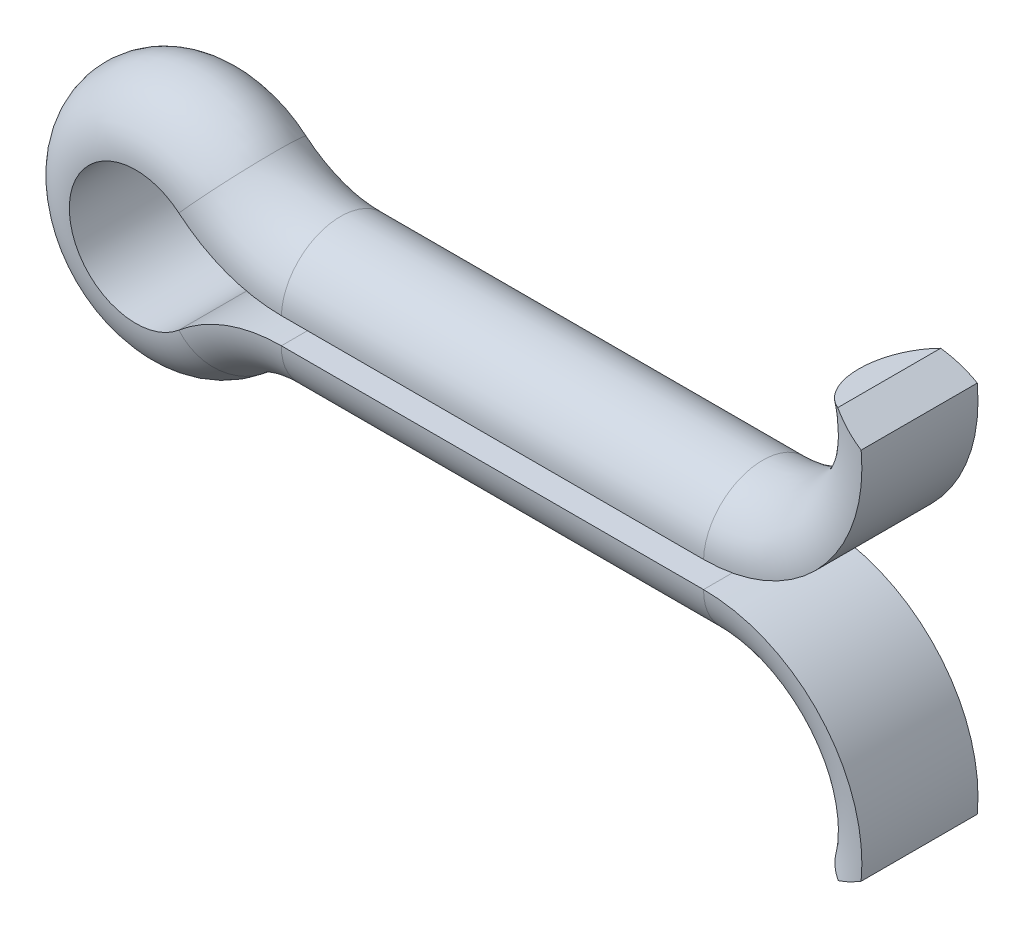
ISO-10303-21;
HEADER;
FILE_DESCRIPTION(('STEP AP214'),'2;1');
FILE_NAME('part.step','',(''),(''),'','','');
FILE_SCHEMA(('AUTOMOTIVE_DESIGN { 1 0 10303 214 1 1 1 1 }'));
ENDSEC;
DATA;
#1=APPLICATION_CONTEXT('core data for automotive mechanical design processes');
#2=APPLICATION_PROTOCOL_DEFINITION('international standard','automotive_design',2000,#1);
#3=PRODUCT_CONTEXT('',#1,'mechanical');
#4=PRODUCT('Part','Part','',(#3));
#5=PRODUCT_RELATED_PRODUCT_CATEGORY('part','',(#4));
#6=PRODUCT_DEFINITION_FORMATION('','',#4);
#7=PRODUCT_DEFINITION_CONTEXT('part definition',#1,'design');
#8=PRODUCT_DEFINITION('design','',#6,#7);
#9=PRODUCT_DEFINITION_SHAPE('','',#8);
#10=(LENGTH_UNIT() NAMED_UNIT(*) SI_UNIT(.MILLI.,.METRE.));
#11=(NAMED_UNIT(*) PLANE_ANGLE_UNIT() SI_UNIT($,.RADIAN.));
#12=(NAMED_UNIT(*) SI_UNIT($,.STERADIAN.) SOLID_ANGLE_UNIT());
#13=UNCERTAINTY_MEASURE_WITH_UNIT(LENGTH_MEASURE(1.E-05),#10,'distance_accuracy_value','');
#14=(GEOMETRIC_REPRESENTATION_CONTEXT(3) GLOBAL_UNCERTAINTY_ASSIGNED_CONTEXT((#13)) GLOBAL_UNIT_ASSIGNED_CONTEXT((#10,
#11,#12)) REPRESENTATION_CONTEXT('',''));
#15=CARTESIAN_POINT('',(0.,0.,0.));
#16=DIRECTION('',(0.,0.,1.));
#17=DIRECTION('',(1.,0.,0.));
#18=AXIS2_PLACEMENT_3D('',#15,#16,#17);
#19=CARTESIAN_POINT('',(10.7572239444696,0.23714244741711,0.));
#20=DIRECTION('',(-0.999803952627873,0.0198004118564028,0.));
#21=DIRECTION('',(0.0198004118564028,0.999803952627873,0.));
#22=AXIS2_PLACEMENT_3D('',#19,#20,#21);
#23=CIRCLE('',#22,1.10004587155963);
#24=CARTESIAN_POINT('',(10.757422856864,3.24718634951002,0.));
#25=DIRECTION('',(0.,0.,1.));
#26=AXIS1_PLACEMENT('',#24,#25);
#27=SURFACE_OF_REVOLUTION('',#23,#26);
#28=CARTESIAN_POINT('',(10.757422856864,3.24718634951002,1.1));
#29=DIRECTION('',(0.,0.,1.));
#30=DIRECTION('',(1.,0.,0.));
#31=AXIS2_PLACEMENT_3D('',#28,#29,#30);
#32=CIRCLE('',#31,3.);
#33=CARTESIAN_POINT('',(10.757422856864,0.24718634951002,1.1));
#34=VERTEX_POINT('',#33);
#35=CARTESIAN_POINT('',(13.743651560264,3.53430676151482,1.1));
#36=VERTEX_POINT('',#35);
#37=EDGE_CURVE('E242',#34,#36,#32,.T.);
#38=ORIENTED_EDGE('',*,*,#37,.T.);
#39=CARTESIAN_POINT('',(13.743651560264,3.53430676151482,1.1));
#40=CARTESIAN_POINT('',(13.6639591945721,3.5833367769402,1.09931651114886));
#41=CARTESIAN_POINT('',(13.5844866817006,3.63223152988366,1.09106448730482));
#42=CARTESIAN_POINT('',(13.4281622196186,3.72840875740991,1.06155884328309));
#43=CARTESIAN_POINT('',(13.351291204114,3.77570296235956,1.040447098492));
#44=CARTESIAN_POINT('',(13.2589826967481,3.83249494614313,1.00787138563784));
#45=CARTESIAN_POINT('',(13.2421129173444,3.84287392708073,1.00161384641751));
#46=CARTESIAN_POINT('',(13.2084837132334,3.86356399421563,0.988544468433443));
#47=CARTESIAN_POINT('',(13.1917246622376,3.87387485049036,0.98173130355574));
#48=CARTESIAN_POINT('',(13.1750413859679,3.88413908704235,0.974655902583276));
#49=B_SPLINE_CURVE_WITH_KNOTS('',3,(#39,#40,#41,#42,#43,#44,#45,#46,#47,#48),.UNSPECIFIED.,.F.,
.F.,(4,2,2,2,4),(0.,0.280156940301102,0.557277650545242,0.619591216138997,0.682058121337036),.UNSPECIFIED.);
#50=CARTESIAN_POINT('',(13.1750413859678,3.88413908704235,0.974655902583249));
#51=VERTEX_POINT('',#50);
#52=EDGE_CURVE('E41',#36,#51,#49,.T.);
#53=ORIENTED_EDGE('',*,*,#52,.T.);
#54=CARTESIAN_POINT('',(13.6712048751013,4.00232784770073,0.));
#55=DIRECTION('',(0.231721825915332,-0.972782090395616,0.));
#56=DIRECTION('',(-0.972782090395616,-0.231721825915332,0.));
#57=AXIS2_PLACEMENT_3D('',#54,#55,#56);
#58=CIRCLE('',#57,1.10004587155963);
#59=CARTESIAN_POINT('',(13.1750413859678,3.88413908704235,-0.974655902583249));
#60=VERTEX_POINT('',#59);
#61=EDGE_CURVE('E240',#51,#60,#58,.T.);
#62=ORIENTED_EDGE('',*,*,#61,.T.);
#63=CARTESIAN_POINT('',(13.1750413859678,3.88413908704235,-0.97465590258325));
#64=CARTESIAN_POINT('',(13.197955964446,3.87004109752357,-0.984374503566978));
#65=CARTESIAN_POINT('',(13.2210233362983,3.85584910324753,-0.99360122509593));
#66=CARTESIAN_POINT('',(13.2673228504737,3.82736374113664,-1.01097652300712));
#67=CARTESIAN_POINT('',(13.2905535829449,3.81307124070054,-1.01913028263372));
#68=CARTESIAN_POINT('',(13.3371859827838,3.78438107366164,-1.03433659609465));
#69=CARTESIAN_POINT('',(13.3605867388318,3.76998396774014,-1.04139299280795));
#70=CARTESIAN_POINT('',(13.4075661035033,3.74108033369036,-1.05437434578761));
#71=CARTESIAN_POINT('',(13.4311442653871,3.7265740804147,-1.06030152626175));
#72=CARTESIAN_POINT('',(13.4785045819684,3.69743606910869,-1.07099110469864));
#73=CARTESIAN_POINT('',(13.502286835833,3.68280425006665,-1.0757528988519));
#74=CARTESIAN_POINT('',(13.5500439906018,3.65342208761412,-1.08405951934727));
#75=CARTESIAN_POINT('',(13.5740191367379,3.63867159332682,-1.08760240868797));
#76=CARTESIAN_POINT('',(13.6221674679681,3.60904876305406,-1.09341533186464));
#77=CARTESIAN_POINT('',(13.6463410532516,3.59417618085564,-1.09568083449255));
#78=CARTESIAN_POINT('',(13.6948910881055,3.56430620602023,-1.09887283326476));
#79=CARTESIAN_POINT('',(13.7192679057749,3.54930858691365,-1.09979157105641));
#80=CARTESIAN_POINT('',(13.743651560264,3.53430676151483,-1.1));
#81=B_SPLINE_CURVE_WITH_KNOTS('',3,(#63,#64,#65,#66,#67,#68,#69,#70,#71,#72,#73,#74,#75,#76,#77,
#78,#79,#80),.UNSPECIFIED.,.F.,.F.,(4,2,2,2,2,2,2,2,4),(0.,0.0858144885708894,0.171197886000917,
0.256275196220509,0.34118315745957,0.426135018482316,0.5112212623776,0.596607459526603,
0.682483636615101),.UNSPECIFIED.);
#82=CARTESIAN_POINT('',(13.743651560264,3.53430676151482,-1.1));
#83=VERTEX_POINT('',#82);
#84=EDGE_CURVE('E263',#60,#83,#81,.T.);
#85=ORIENTED_EDGE('',*,*,#84,.T.);
#86=CARTESIAN_POINT('',(10.757422856864,3.24718634951002,-1.1));
#87=DIRECTION('',(0.,0.,1.));
#88=DIRECTION('',(1.,0.,0.));
#89=AXIS2_PLACEMENT_3D('',#86,#87,#88);
#90=CIRCLE('',#89,3.);
#91=CARTESIAN_POINT('',(10.757422856864,0.24718634951002,-1.1));
#92=VERTEX_POINT('',#91);
#93=EDGE_CURVE('E244',#92,#83,#90,.T.);
#94=ORIENTED_EDGE('',*,*,#93,.F.);
#95=EDGE_CURVE('E228',#34,#92,#23,.T.);
#96=ORIENTED_EDGE('',*,*,#95,.F.);
#97=EDGE_LOOP('',(#38,#53,#62,#85,#94,#96));
#98=FACE_BOUND('',#97,.T.);
#99=ADVANCED_FACE('F32',(#98),#27,.T.);
#100=CARTESIAN_POINT('',(10.757422856864,3.24718634951002,0.));
#101=DIRECTION('',(0.,0.,1.));
#102=DIRECTION('',(1.,0.,0.));
#103=AXIS2_PLACEMENT_3D('',#100,#101,#102);
#104=CYLINDRICAL_SURFACE('',#103,3.);
#105=ORIENTED_EDGE('',*,*,#93,.T.);
#106=DIRECTION('',(0.,0.,1.));
#107=VECTOR('',#106,1.);
#108=CARTESIAN_POINT('',(13.743651560264,3.53430676151482,0.));
#109=LINE('',#108,#107);
#110=EDGE_CURVE('E261',#83,#36,#109,.T.);
#111=ORIENTED_EDGE('',*,*,#110,.T.);
#112=ORIENTED_EDGE('',*,*,#37,.F.);
#113=DIRECTION('',(0.,0.,1.));
#114=VECTOR('',#113,1.);
#115=CARTESIAN_POINT('',(10.757422856864,0.24718634951002,1.1));
#116=LINE('',#115,#114);
#117=EDGE_CURVE('E234',#92,#34,#116,.T.);
#118=ORIENTED_EDGE('',*,*,#117,.F.);
#119=EDGE_LOOP('',(#105,#111,#112,#118));
#120=FACE_BOUND('',#119,.T.);
#121=ADVANCED_FACE('F216',(#120),#104,.T.);
#122=CARTESIAN_POINT('',(2.75722394446964,0.237142447417109,0.));
#123=DIRECTION('',(-0.999803952627873,0.0198004118564028,0.));
#124=DIRECTION('',(0.0198004118564028,0.999803952627873,0.));
#125=AXIS2_PLACEMENT_3D('',#122,#123,#124);
#126=CIRCLE('',#125,1.10004587155963);
#127=DIRECTION('',(1.,0.,0.));
#128=VECTOR('',#127,1.);
#129=SURFACE_OF_LINEAR_EXTRUSION('',#126,#128);
#130=CARTESIAN_POINT('',(2.75742285686398,0.247186349510019,1.1));
#131=VERTEX_POINT('',#130);
#132=CARTESIAN_POINT('',(2.75742285686398,0.247186349510019,-1.1));
#133=VERTEX_POINT('',#132);
#134=EDGE_CURVE('E207',#131,#133,#126,.T.);
#135=ORIENTED_EDGE('',*,*,#134,.F.);
#136=DIRECTION('',(1.,0.,0.));
#137=VECTOR('',#136,1.);
#138=CARTESIAN_POINT('',(2.75742285686398,0.247186349510019,1.1));
#139=LINE('',#138,#137);
#140=EDGE_CURVE('E233',#131,#34,#139,.T.);
#141=ORIENTED_EDGE('',*,*,#140,.T.);
#142=ORIENTED_EDGE('',*,*,#95,.T.);
#143=DIRECTION('',(1.,0.,0.));
#144=VECTOR('',#143,1.);
#145=CARTESIAN_POINT('',(2.75742285686398,0.247186349510019,-1.1));
#146=LINE('',#145,#144);
#147=EDGE_CURVE('E237',#133,#92,#146,.T.);
#148=ORIENTED_EDGE('',*,*,#147,.F.);
#149=EDGE_LOOP('',(#135,#141,#142,#148));
#150=FACE_BOUND('',#149,.T.);
#151=ADVANCED_FACE('F213',(#150),#129,.F.);
#152=CARTESIAN_POINT('',(2.75742285686398,0.247186349510019,1.1));
#153=DIRECTION('',(0.,1.,0.));
#154=DIRECTION('',(-1.,0.,0.));
#155=AXIS2_PLACEMENT_3D('',#152,#153,#154);
#156=PLANE('',#155);
#157=DIRECTION('',(0.,0.,1.));
#158=VECTOR('',#157,1.);
#159=CARTESIAN_POINT('',(2.75742285686398,0.247186349510019,1.1));
#160=LINE('',#159,#158);
#161=EDGE_CURVE('E204',#133,#131,#160,.T.);
#162=ORIENTED_EDGE('',*,*,#161,.F.);
#163=ORIENTED_EDGE('',*,*,#147,.T.);
#164=ORIENTED_EDGE('',*,*,#117,.T.);
#165=ORIENTED_EDGE('',*,*,#140,.F.);
#166=EDGE_LOOP('',(#162,#163,#164,#165));
#167=FACE_BOUND('',#166,.T.);
#168=ADVANCED_FACE('F189',(#167),#156,.F.);
#169=CARTESIAN_POINT('',(0.808922912871809,0.95290818408294,0.));
#170=DIRECTION('',(-0.749284422284325,0.662248332970379,0.));
#171=DIRECTION('',(0.662248332970379,0.749284422284325,0.));
#172=AXIS2_PLACEMENT_3D('',#169,#170,#171);
#173=CIRCLE('',#172,1.10004587155963);
#174=CARTESIAN_POINT('',(2.75742285686396,3.24718634951002,0.));
#175=DIRECTION('',(0.,0.,1.));
#176=AXIS1_PLACEMENT('',#174,#175);
#177=SURFACE_OF_REVOLUTION('',#173,#176);
#178=CARTESIAN_POINT('',(0.815575774565408,0.96043539915084,1.1));
#179=VERTEX_POINT('',#178);
#180=CARTESIAN_POINT('',(0.815575774565408,0.96043539915084,-1.1));
#181=VERTEX_POINT('',#180);
#182=EDGE_CURVE('E192',#179,#181,#173,.T.);
#183=ORIENTED_EDGE('',*,*,#182,.F.);
#184=CARTESIAN_POINT('',(2.75742285686396,3.24718634951002,1.1));
#185=DIRECTION('',(0.,0.,1.));
#186=DIRECTION('',(1.,0.,0.));
#187=AXIS2_PLACEMENT_3D('',#184,#185,#186);
#188=CIRCLE('',#187,3.);
#189=EDGE_CURVE('E211',#179,#131,#188,.T.);
#190=ORIENTED_EDGE('',*,*,#189,.T.);
#191=ORIENTED_EDGE('',*,*,#134,.T.);
#192=CARTESIAN_POINT('',(2.75742285686396,3.24718634951002,-1.1));
#193=DIRECTION('',(0.,0.,1.));
#194=DIRECTION('',(1.,0.,0.));
#195=AXIS2_PLACEMENT_3D('',#192,#193,#194);
#196=CIRCLE('',#195,3.);
#197=EDGE_CURVE('E429',#181,#133,#196,.T.);
#198=ORIENTED_EDGE('',*,*,#197,.F.);
#199=EDGE_LOOP('',(#183,#190,#191,#198));
#200=FACE_BOUND('',#199,.T.);
#201=ADVANCED_FACE('F184',(#200),#177,.T.);
#202=CARTESIAN_POINT('',(2.75742285686396,3.24718634951002,0.));
#203=DIRECTION('',(0.,0.,1.));
#204=DIRECTION('',(1.,0.,0.));
#205=AXIS2_PLACEMENT_3D('',#202,#203,#204);
#206=CYLINDRICAL_SURFACE('',#205,3.);
#207=DIRECTION('',(0.,0.,1.));
#208=VECTOR('',#207,1.);
#209=CARTESIAN_POINT('',(0.815575774565408,0.96043539915084,1.1));
#210=LINE('',#209,#208);
#211=EDGE_CURVE('E198',#181,#179,#210,.T.);
#212=ORIENTED_EDGE('',*,*,#211,.F.);
#213=ORIENTED_EDGE('',*,*,#197,.T.);
#214=ORIENTED_EDGE('',*,*,#161,.T.);
#215=ORIENTED_EDGE('',*,*,#189,.F.);
#216=EDGE_LOOP('',(#212,#213,#214,#215));
#217=FACE_BOUND('',#216,.T.);
#218=ADVANCED_FACE('F180',(#217),#206,.T.);
#219=CARTESIAN_POINT('',(0.809226154942991,-0.952650679114565,0.));
#220=DIRECTION('',(0.774917336945426,0.632062592550302,0.));
#221=DIRECTION('',(0.632062592550302,-0.774917336945426,0.));
#222=AXIS2_PLACEMENT_3D('',#219,#220,#221);
#223=CIRCLE('',#222,1.10004587155963);
#224=CARTESIAN_POINT('',(0.,0.,0.));
#225=DIRECTION('',(0.,0.,-1.));
#226=AXIS1_PLACEMENT('',#224,#225);
#227=SURFACE_OF_REVOLUTION('',#223,#226);
#228=CARTESIAN_POINT('',(0.815575774565398,-0.960435399150849,1.1));
#229=VERTEX_POINT('',#228);
#230=CARTESIAN_POINT('',(0.815575774565398,-0.960435399150849,-1.1));
#231=VERTEX_POINT('',#230);
#232=EDGE_CURVE('E171',#229,#231,#223,.T.);
#233=ORIENTED_EDGE('',*,*,#232,.F.);
#234=CARTESIAN_POINT('',(0.,0.,1.1));
#235=DIRECTION('',(0.,0.,-1.));
#236=DIRECTION('',(-1.,0.,0.));
#237=AXIS2_PLACEMENT_3D('',#234,#235,#236);
#238=CIRCLE('',#237,1.26);
#239=EDGE_CURVE('E197',#229,#179,#238,.T.);
#240=ORIENTED_EDGE('',*,*,#239,.T.);
#241=ORIENTED_EDGE('',*,*,#182,.T.);
#242=CARTESIAN_POINT('',(0.,0.,-1.1));
#243=DIRECTION('',(0.,0.,-1.));
#244=DIRECTION('',(-1.,0.,0.));
#245=AXIS2_PLACEMENT_3D('',#242,#243,#244);
#246=CIRCLE('',#245,1.26);
#247=EDGE_CURVE('E201',#231,#181,#246,.T.);
#248=ORIENTED_EDGE('',*,*,#247,.F.);
#249=EDGE_LOOP('',(#233,#240,#241,#248));
#250=FACE_BOUND('',#249,.T.);
#251=ADVANCED_FACE('F177',(#250),#227,.T.);
#252=CARTESIAN_POINT('',(0.,0.,0.));
#253=DIRECTION('',(0.,0.,-1.));
#254=DIRECTION('',(-1.,0.,0.));
#255=AXIS2_PLACEMENT_3D('',#252,#253,#254);
#256=CYLINDRICAL_SURFACE('',#255,1.26);
#257=DIRECTION('',(0.,0.,1.));
#258=VECTOR('',#257,1.);
#259=CARTESIAN_POINT('',(0.815575774565398,-0.960435399150849,1.1));
#260=LINE('',#259,#258);
#261=EDGE_CURVE('E168',#231,#229,#260,.T.);
#262=ORIENTED_EDGE('',*,*,#261,.F.);
#263=ORIENTED_EDGE('',*,*,#247,.T.);
#264=ORIENTED_EDGE('',*,*,#211,.T.);
#265=ORIENTED_EDGE('',*,*,#239,.F.);
#266=EDGE_LOOP('',(#262,#263,#264,#265));
#267=FACE_BOUND('',#266,.T.);
#268=ADVANCED_FACE('F161',(#267),#256,.F.);
#269=CARTESIAN_POINT('',(2.7576217692583,-0.237142447417109,0.));
#270=DIRECTION('',(0.999803952627873,-0.0198004118563884,0.));
#271=DIRECTION('',(-0.0198004118563884,-0.999803952627873,0.));
#272=AXIS2_PLACEMENT_3D('',#269,#270,#271);
#273=CIRCLE('',#272,1.10004587155963);
#274=CARTESIAN_POINT('',(2.75742285686396,-3.24718634951002,0.));
#275=DIRECTION('',(0.,0.,1.));
#276=AXIS1_PLACEMENT('',#274,#275);
#277=SURFACE_OF_REVOLUTION('',#273,#276);
#278=CARTESIAN_POINT('',(2.75742285686396,-0.247186349510019,1.1));
#279=VERTEX_POINT('',#278);
#280=CARTESIAN_POINT('',(2.75742285686396,-0.247186349510019,-1.1));
#281=VERTEX_POINT('',#280);
#282=EDGE_CURVE('E118',#279,#281,#273,.T.);
#283=ORIENTED_EDGE('',*,*,#282,.F.);
#284=CARTESIAN_POINT('',(2.75742285686396,-3.24718634951002,1.1));
#285=DIRECTION('',(0.,0.,1.));
#286=DIRECTION('',(1.,0.,0.));
#287=AXIS2_PLACEMENT_3D('',#284,#285,#286);
#288=CIRCLE('',#287,3.);
#289=EDGE_CURVE('E175',#279,#229,#288,.T.);
#290=ORIENTED_EDGE('',*,*,#289,.T.);
#291=ORIENTED_EDGE('',*,*,#232,.T.);
#292=CARTESIAN_POINT('',(2.75742285686396,-3.24718634951002,-1.1));
#293=DIRECTION('',(0.,0.,1.));
#294=DIRECTION('',(1.,0.,0.));
#295=AXIS2_PLACEMENT_3D('',#292,#293,#294);
#296=CIRCLE('',#295,3.);
#297=EDGE_CURVE('E431',#281,#231,#296,.T.);
#298=ORIENTED_EDGE('',*,*,#297,.F.);
#299=EDGE_LOOP('',(#283,#290,#291,#298));
#300=FACE_BOUND('',#299,.T.);
#301=ADVANCED_FACE('F156',(#300),#277,.T.);
#302=CARTESIAN_POINT('',(2.75742285686396,-3.24718634951002,0.));
#303=DIRECTION('',(0.,0.,1.));
#304=DIRECTION('',(1.,0.,0.));
#305=AXIS2_PLACEMENT_3D('',#302,#303,#304);
#306=CYLINDRICAL_SURFACE('',#305,3.);
#307=DIRECTION('',(0.,0.,1.));
#308=VECTOR('',#307,1.);
#309=CARTESIAN_POINT('',(2.75742285686396,-0.247186349510019,1.1));
#310=LINE('',#309,#308);
#311=EDGE_CURVE('E114',#281,#279,#310,.T.);
#312=ORIENTED_EDGE('',*,*,#311,.F.);
#313=ORIENTED_EDGE('',*,*,#297,.T.);
#314=ORIENTED_EDGE('',*,*,#261,.T.);
#315=ORIENTED_EDGE('',*,*,#289,.F.);
#316=EDGE_LOOP('',(#312,#313,#314,#315));
#317=FACE_BOUND('',#316,.T.);
#318=ADVANCED_FACE('F153',(#317),#306,.T.);
#319=CARTESIAN_POINT('',(10.7576217692583,-0.237142447417108,0.));
#320=DIRECTION('',(0.999803952627873,-0.0198004118563884,0.));
#321=DIRECTION('',(-0.0198004118563884,-0.999803952627873,0.));
#322=AXIS2_PLACEMENT_3D('',#319,#320,#321);
#323=CIRCLE('',#322,1.10004587155963);
#324=DIRECTION('',(-1.,0.,0.));
#325=VECTOR('',#324,1.);
#326=SURFACE_OF_LINEAR_EXTRUSION('',#323,#325);
#327=CARTESIAN_POINT('',(10.757422856864,-0.247186349510018,1.1));
#328=VERTEX_POINT('',#327);
#329=CARTESIAN_POINT('',(10.757422856864,-0.247186349510018,-1.1));
#330=VERTEX_POINT('',#329);
#331=EDGE_CURVE('E121',#328,#330,#323,.T.);
#332=ORIENTED_EDGE('',*,*,#331,.F.);
#333=DIRECTION('',(-1.,0.,0.));
#334=VECTOR('',#333,1.);
#335=CARTESIAN_POINT('',(10.757422856864,-0.247186349510018,1.1));
#336=LINE('',#335,#334);
#337=EDGE_CURVE('E107',#328,#279,#336,.T.);
#338=ORIENTED_EDGE('',*,*,#337,.T.);
#339=ORIENTED_EDGE('',*,*,#282,.T.);
#340=DIRECTION('',(-1.,0.,0.));
#341=VECTOR('',#340,1.);
#342=CARTESIAN_POINT('',(10.757422856864,-0.247186349510018,-1.1));
#343=LINE('',#342,#341);
#344=EDGE_CURVE('E117',#330,#281,#343,.T.);
#345=ORIENTED_EDGE('',*,*,#344,.F.);
#346=EDGE_LOOP('',(#332,#338,#339,#345));
#347=FACE_BOUND('',#346,.T.);
#348=ADVANCED_FACE('F123',(#347),#326,.F.);
#349=CARTESIAN_POINT('',(10.757422856864,-0.247186349510018,1.1));
#350=DIRECTION('',(0.,-1.,0.));
#351=DIRECTION('',(1.,0.,0.));
#352=AXIS2_PLACEMENT_3D('',#349,#350,#351);
#353=PLANE('',#352);
#354=DIRECTION('',(0.,0.,1.));
#355=VECTOR('',#354,1.);
#356=CARTESIAN_POINT('',(10.757422856864,-0.247186349510018,1.1));
#357=LINE('',#356,#355);
#358=EDGE_CURVE('E112',#330,#328,#357,.T.);
#359=ORIENTED_EDGE('',*,*,#358,.F.);
#360=ORIENTED_EDGE('',*,*,#344,.T.);
#361=ORIENTED_EDGE('',*,*,#311,.T.);
#362=ORIENTED_EDGE('',*,*,#337,.F.);
#363=EDGE_LOOP('',(#359,#360,#361,#362));
#364=FACE_BOUND('',#363,.T.);
#365=ADVANCED_FACE('F109',(#364),#353,.F.);
#366=CARTESIAN_POINT('',(10.757422856864,-3.24718634951002,0.));
#367=DIRECTION('',(0.,0.,-1.));
#368=DIRECTION('',(-1.,0.,0.));
#369=AXIS2_PLACEMENT_3D('',#366,#367,#368);
#370=CYLINDRICAL_SURFACE('',#369,3.);
#371=CARTESIAN_POINT('',(10.757422856864,-3.24718634951002,1.1));
#372=DIRECTION('',(0.,0.,-1.));
#373=DIRECTION('',(-1.,0.,0.));
#374=AXIS2_PLACEMENT_3D('',#371,#372,#373);
#375=CIRCLE('',#374,3.);
#376=CARTESIAN_POINT('',(13.7429142387769,-3.54187467388624,1.1));
#377=VERTEX_POINT('',#376);
#378=EDGE_CURVE('E127',#328,#377,#375,.T.);
#379=ORIENTED_EDGE('',*,*,#378,.T.);
#380=DIRECTION('',(0.,0.,-1.));
#381=VECTOR('',#380,1.);
#382=CARTESIAN_POINT('',(13.7429142387769,-3.54187467388624,0.));
#383=LINE('',#382,#381);
#384=CARTESIAN_POINT('',(13.7429142387769,-3.54187467388624,-1.1));
#385=VERTEX_POINT('',#384);
#386=EDGE_CURVE('E259',#377,#385,#383,.T.);
#387=ORIENTED_EDGE('',*,*,#386,.T.);
#388=CARTESIAN_POINT('',(10.757422856864,-3.24718634951002,-1.1));
#389=DIRECTION('',(0.,0.,-1.));
#390=DIRECTION('',(-1.,0.,0.));
#391=AXIS2_PLACEMENT_3D('',#388,#389,#390);
#392=CIRCLE('',#391,3.);
#393=EDGE_CURVE('E135',#330,#385,#392,.T.);
#394=ORIENTED_EDGE('',*,*,#393,.F.);
#395=ORIENTED_EDGE('',*,*,#358,.T.);
#396=EDGE_LOOP('',(#379,#387,#394,#395));
#397=FACE_BOUND('',#396,.T.);
#398=ADVANCED_FACE('F137',(#397),#370,.T.);
#399=CARTESIAN_POINT('',(10.757422856864,-3.24718634951002,0.));
#400=DIRECTION('',(0.,0.,-1.));
#401=AXIS1_PLACEMENT('',#399,#400);
#402=SURFACE_OF_REVOLUTION('',#323,#401);
#403=CARTESIAN_POINT('',(13.6711050457908,-4.00271294336578,0.));
#404=DIRECTION('',(-0.270055549652723,-0.962844743508405,0.));
#405=DIRECTION('',(-0.962844743508405,0.270055549652723,0.));
#406=AXIS2_PLACEMENT_3D('',#403,#404,#405);
#407=CIRCLE('',#406,1.10004587155963);
#408=CARTESIAN_POINT('',(13.1892665710306,-3.867568461327,0.979626751753233));
#409=VERTEX_POINT('',#408);
#410=CARTESIAN_POINT('',(13.1892665710306,-3.867568461327,-0.979626751753233));
#411=VERTEX_POINT('',#410);
#412=EDGE_CURVE('E138',#409,#411,#407,.T.);
#413=ORIENTED_EDGE('',*,*,#412,.F.);
#414=CARTESIAN_POINT('',(13.1892665710306,-3.867568461327,0.979626751753233));
#415=CARTESIAN_POINT('',(13.2647650686252,-3.82315503188411,1.01143090288107));
#416=CARTESIAN_POINT('',(13.3422940578038,-3.77754712708644,1.03771501025942));
#417=CARTESIAN_POINT('',(13.4987280862099,-3.68552182983625,1.07707997364368));
#418=CARTESIAN_POINT('',(13.5776026536832,-3.63912236297372,1.09032610569814));
#419=CARTESIAN_POINT('',(13.6711471861507,-3.58409300974312,1.09743230254566));
#420=CARTESIAN_POINT('',(13.685470615049,-3.57566697983493,1.09828370844159));
#421=CARTESIAN_POINT('',(13.7141662447227,-3.55878622903275,1.09950645077856));
#422=CARTESIAN_POINT('',(13.7285384811499,-3.55033148716589,1.09987665800546));
#423=CARTESIAN_POINT('',(13.7429142387769,-3.54187467388619,1.1));
#424=B_SPLINE_CURVE_WITH_KNOTS('',3,(#414,#415,#416,#417,#418,#419,#420,#421,#422,#423),
.UNSPECIFIED.,.F.,.F.,(4,2,2,2,4),(0.,0.279933009280786,0.556269899079249,0.606184359787461,
0.656215743009665),.UNSPECIFIED.);
#425=EDGE_CURVE('E132',#409,#377,#424,.T.);
#426=ORIENTED_EDGE('',*,*,#425,.T.);
#427=ORIENTED_EDGE('',*,*,#378,.F.);
#428=ORIENTED_EDGE('',*,*,#331,.T.);
#429=ORIENTED_EDGE('',*,*,#393,.T.);
#430=CARTESIAN_POINT('',(13.7429142387769,-3.54187467388624,-1.1));
#431=CARTESIAN_POINT('',(13.6621744064737,-3.58937141831792,-1.09930884234132));
#432=CARTESIAN_POINT('',(13.5816451272516,-3.6367443008887,-1.09082829159007));
#433=CARTESIAN_POINT('',(13.4234085157802,-3.72983000196591,-1.06039593551358));
#434=CARTESIAN_POINT('',(13.3456795003928,-3.77555557599134,-1.03859850754108));
#435=CARTESIAN_POINT('',(13.256129413539,-3.82823512049621,-1.00618802723713));
#436=CARTESIAN_POINT('',(13.2427013448593,-3.83613443769937,-1.00112913798381));
#437=CARTESIAN_POINT('',(13.2159206415672,-3.85188869657854,-0.990647504024644));
#438=CARTESIAN_POINT('',(13.2025682162623,-3.85974351512548,-0.985224039320634));
#439=CARTESIAN_POINT('',(13.1892665710306,-3.867568461327,-0.979626751753237));
#440=B_SPLINE_CURVE_WITH_KNOTS('',3,(#430,#431,#432,#433,#434,#435,#436,#437,#438,#439),
.UNSPECIFIED.,.F.,.F.,(4,2,2,2,4),(0.,0.280492169537114,0.557792826593513,0.606932613720341,
0.656172472223603),.UNSPECIFIED.);
#441=EDGE_CURVE('E250',#385,#411,#440,.T.);
#442=ORIENTED_EDGE('',*,*,#441,.T.);
#443=EDGE_LOOP('',(#413,#426,#427,#428,#429,#442));
#444=FACE_BOUND('',#443,.T.);
#445=ADVANCED_FACE('F131',(#444),#402,.F.);
#446=CARTESIAN_POINT('',(13.6712048751013,4.00232784770073,0.));
#447=DIRECTION('',(-0.231721825915332,0.972782090395616,0.));
#448=DIRECTION('',(-0.972782090395616,-0.231721825915332,0.));
#449=AXIS2_PLACEMENT_3D('',#446,#447,#448);
#450=PLANE('',#449);
#451=ORIENTED_EDGE('',*,*,#61,.F.);
#452=DIRECTION('',(0.,0.,-1.));
#453=VECTOR('',#452,1.);
#454=CARTESIAN_POINT('',(13.1750413859678,3.88413908704235,-1.1));
#455=LINE('',#454,#453);
#456=EDGE_CURVE('E11',#51,#60,#455,.T.);
#457=ORIENTED_EDGE('',*,*,#456,.T.);
#458=EDGE_LOOP('',(#451,#457));
#459=FACE_BOUND('',#458,.T.);
#460=ADVANCED_FACE('F285',(#459),#450,.T.);
#461=CARTESIAN_POINT('',(13.6711050457908,-4.00271294336578,0.));
#462=DIRECTION('',(0.270055549652723,0.962844743508405,0.));
#463=DIRECTION('',(-0.962844743508405,0.270055549652723,0.));
#464=AXIS2_PLACEMENT_3D('',#461,#462,#463);
#465=PLANE('',#464);
#466=ORIENTED_EDGE('',*,*,#412,.T.);
#467=DIRECTION('',(0.,0.,1.));
#468=VECTOR('',#467,1.);
#469=CARTESIAN_POINT('',(13.1892665710306,-3.867568461327,1.1));
#470=LINE('',#469,#468);
#471=EDGE_CURVE('E247',#411,#409,#470,.T.);
#472=ORIENTED_EDGE('',*,*,#471,.T.);
#473=EDGE_LOOP('',(#466,#472));
#474=FACE_BOUND('',#473,.T.);
#475=ADVANCED_FACE('F280',(#474),#465,.F.);
#476=CARTESIAN_POINT('',(13.1892665710306,-3.867568461327,0.));
#477=DIRECTION('',(0.507041741796045,-0.861921499950217,0.));
#478=DIRECTION('',(0.,0.,-1.));
#479=AXIS2_PLACEMENT_3D('',#476,#477,#478);
#480=PLANE('',#479);
#481=ORIENTED_EDGE('',*,*,#441,.F.);
#482=ORIENTED_EDGE('',*,*,#386,.F.);
#483=ORIENTED_EDGE('',*,*,#425,.F.);
#484=ORIENTED_EDGE('',*,*,#471,.F.);
#485=EDGE_LOOP('',(#481,#482,#483,#484));
#486=FACE_BOUND('',#485,.T.);
#487=ADVANCED_FACE('F224',(#486),#480,.T.);
#488=CARTESIAN_POINT('',(13.743651560264,3.53430676151482,0.));
#489=DIRECTION('',(-0.524008738281907,-0.851712887189224,0.));
#490=DIRECTION('',(0.,0.,1.));
#491=AXIS2_PLACEMENT_3D('',#488,#489,#490);
#492=PLANE('',#491);
#493=ORIENTED_EDGE('',*,*,#84,.F.);
#494=ORIENTED_EDGE('',*,*,#456,.F.);
#495=ORIENTED_EDGE('',*,*,#52,.F.);
#496=ORIENTED_EDGE('',*,*,#110,.F.);
#497=EDGE_LOOP('',(#493,#494,#495,#496));
#498=FACE_BOUND('',#497,.T.);
#499=ADVANCED_FACE('F34',(#498),#492,.F.);
#500=CLOSED_SHELL('',(#99,#121,#151,#168,#201,#218,#251,#268,#301,#318,#348,#365,#398,#445,#460,
#475,#487,#499));
#501=MANIFOLD_SOLID_BREP('B2',#500);
#502=ADVANCED_BREP_SHAPE_REPRESENTATION('',(#18,#501),#14);
#503=SHAPE_DEFINITION_REPRESENTATION(#9,#502);
ENDSEC;
END-ISO-10303-21;
